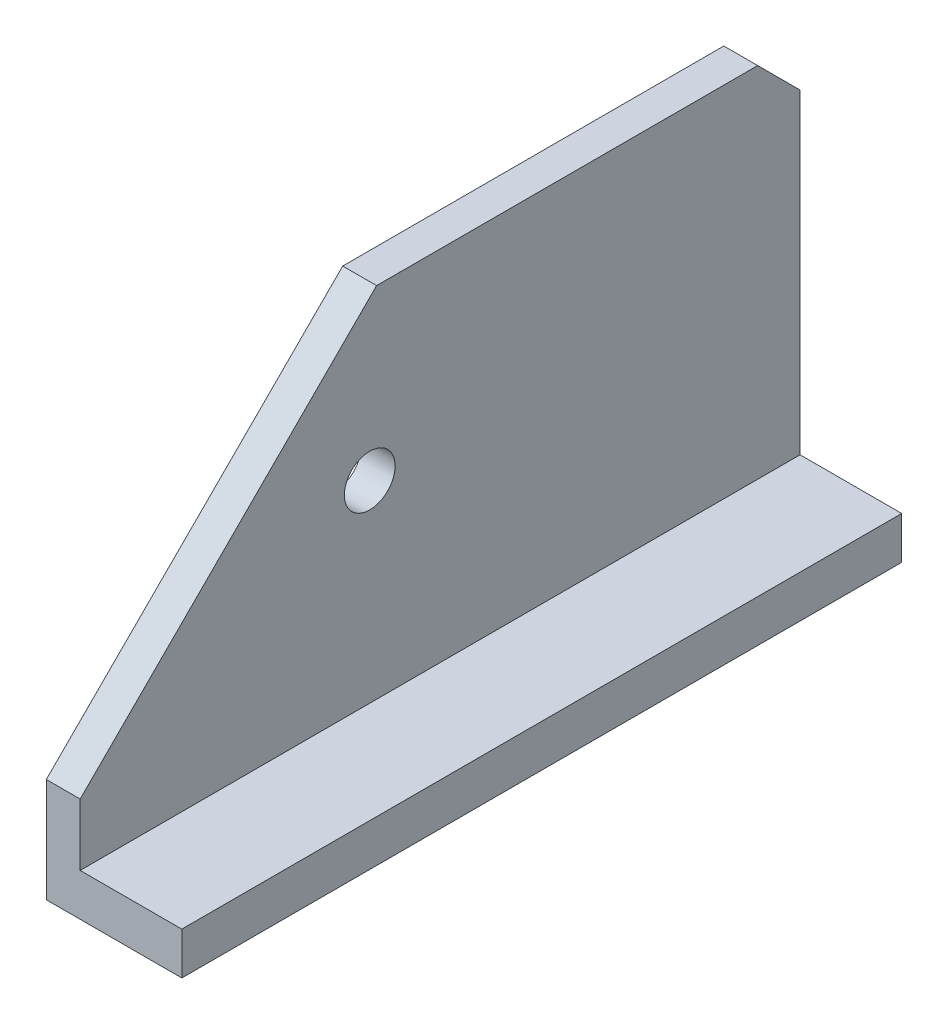
ISO-10303-21;
HEADER;
FILE_DESCRIPTION(('STEP AP214'),'2;1');
FILE_NAME('part.step','',(''),(''),'','','');
FILE_SCHEMA(('AUTOMOTIVE_DESIGN { 1 0 10303 214 1 1 1 1 }'));
ENDSEC;
DATA;
#1=APPLICATION_CONTEXT('core data for automotive mechanical design processes');
#2=APPLICATION_PROTOCOL_DEFINITION('international standard','automotive_design',2000,#1);
#3=PRODUCT_CONTEXT('',#1,'mechanical');
#4=PRODUCT('Part','Part','',(#3));
#5=PRODUCT_RELATED_PRODUCT_CATEGORY('part','',(#4));
#6=PRODUCT_DEFINITION_FORMATION('','',#4);
#7=PRODUCT_DEFINITION_CONTEXT('part definition',#1,'design');
#8=PRODUCT_DEFINITION('design','',#6,#7);
#9=PRODUCT_DEFINITION_SHAPE('','',#8);
#10=(LENGTH_UNIT() NAMED_UNIT(*) SI_UNIT(.MILLI.,.METRE.));
#11=(NAMED_UNIT(*) PLANE_ANGLE_UNIT() SI_UNIT($,.RADIAN.));
#12=(NAMED_UNIT(*) SI_UNIT($,.STERADIAN.) SOLID_ANGLE_UNIT());
#13=UNCERTAINTY_MEASURE_WITH_UNIT(LENGTH_MEASURE(1.E-05),#10,'distance_accuracy_value','');
#14=(GEOMETRIC_REPRESENTATION_CONTEXT(3) GLOBAL_UNCERTAINTY_ASSIGNED_CONTEXT((#13)) GLOBAL_UNIT_ASSIGNED_CONTEXT((#10,
#11,#12)) REPRESENTATION_CONTEXT('',''));
#15=CARTESIAN_POINT('',(0.,0.,0.));
#16=DIRECTION('',(0.,0.,1.));
#17=DIRECTION('',(1.,0.,0.));
#18=AXIS2_PLACEMENT_3D('',#15,#16,#17);
#19=CARTESIAN_POINT('',(0.,0.,85.));
#20=DIRECTION('',(-1.,0.,0.));
#21=DIRECTION('',(0.,0.,1.));
#22=AXIS2_PLACEMENT_3D('',#19,#20,#21);
#23=PLANE('',#22);
#24=CARTESIAN_POINT('',(0.,22.773427236541,50.8134692351987));
#25=DIRECTION('',(-1.,0.,0.));
#26=DIRECTION('',(0.,0.,1.));
#27=AXIS2_PLACEMENT_3D('',#24,#25,#26);
#28=CIRCLE('',#27,2.99999999999999);
#29=CARTESIAN_POINT('',(0.,22.773427236541,53.8134692351987));
#30=VERTEX_POINT('',#29);
#31=EDGE_CURVE('E129',#30,#30,#28,.T.);
#32=ORIENTED_EDGE('',*,*,#31,.T.);
#33=EDGE_LOOP('',(#32));
#34=FACE_BOUND('',#33,.T.);
#35=DIRECTION('',(0.,1.,0.));
#36=VECTOR('',#35,1.);
#37=CARTESIAN_POINT('',(0.,0.,0.));
#38=LINE('',#37,#36);
#39=CARTESIAN_POINT('',(0.,0.,0.));
#40=VERTEX_POINT('',#39);
#41=CARTESIAN_POINT('',(0.,37.3000000000002,0.));
#42=VERTEX_POINT('',#41);
#43=EDGE_CURVE('E127',#40,#42,#38,.T.);
#44=ORIENTED_EDGE('',*,*,#43,.T.);
#45=DIRECTION('',(0.,-0.707106781186548,-0.707106781186548));
#46=VECTOR('',#45,1.);
#47=CARTESIAN_POINT('',(0.,42.3000000000002,5.));
#48=LINE('',#47,#46);
#49=CARTESIAN_POINT('',(0.,42.3000000000002,5.00000000000002));
#50=VERTEX_POINT('',#49);
#51=EDGE_CURVE('E11',#42,#50,#48,.F.);
#52=ORIENTED_EDGE('',*,*,#51,.T.);
#53=DIRECTION('',(0.,0.,-1.));
#54=VECTOR('',#53,1.);
#55=CARTESIAN_POINT('',(0.,42.3000000000002,85.));
#56=LINE('',#55,#54);
#57=CARTESIAN_POINT('',(0.,42.3000000000002,49.9999999999999));
#58=VERTEX_POINT('',#57);
#59=EDGE_CURVE('E144',#58,#50,#56,.T.);
#60=ORIENTED_EDGE('',*,*,#59,.F.);
#61=DIRECTION('',(0.,-0.707106781186546,0.707106781186549));
#62=VECTOR('',#61,1.);
#63=CARTESIAN_POINT('',(0.,7.30000000000024,85.));
#64=LINE('',#63,#62);
#65=CARTESIAN_POINT('',(0.,7.30000000000024,85.));
#66=VERTEX_POINT('',#65);
#67=EDGE_CURVE('E152',#58,#66,#64,.T.);
#68=ORIENTED_EDGE('',*,*,#67,.T.);
#69=DIRECTION('',(0.,1.,0.));
#70=VECTOR('',#69,1.);
#71=CARTESIAN_POINT('',(0.,0.,85.));
#72=LINE('',#71,#70);
#73=CARTESIAN_POINT('',(0.,0.,85.));
#74=VERTEX_POINT('',#73);
#75=EDGE_CURVE('E105',#74,#66,#72,.T.);
#76=ORIENTED_EDGE('',*,*,#75,.F.);
#77=DIRECTION('',(0.,0.,-1.));
#78=VECTOR('',#77,1.);
#79=CARTESIAN_POINT('',(0.,0.,85.));
#80=LINE('',#79,#78);
#81=EDGE_CURVE('E126',#74,#40,#80,.T.);
#82=ORIENTED_EDGE('',*,*,#81,.T.);
#83=EDGE_LOOP('',(#44,#52,#60,#68,#76,#82));
#84=FACE_BOUND('',#83,.T.);
#85=ADVANCED_FACE('F32',(#34,#84),#23,.F.);
#86=CARTESIAN_POINT('',(0.,42.3000000000002,85.));
#87=DIRECTION('',(0.,-1.,0.));
#88=DIRECTION('',(0.,0.,-1.));
#89=AXIS2_PLACEMENT_3D('',#86,#87,#88);
#90=PLANE('',#89);
#91=ORIENTED_EDGE('',*,*,#59,.T.);
#92=DIRECTION('',(-1.,0.,0.));
#93=VECTOR('',#92,1.);
#94=CARTESIAN_POINT('',(0.,42.3000000000002,5.));
#95=LINE('',#94,#93);
#96=CARTESIAN_POINT('',(-4.,42.3000000000002,5.00000000000002));
#97=VERTEX_POINT('',#96);
#98=EDGE_CURVE('E154',#50,#97,#95,.T.);
#99=ORIENTED_EDGE('',*,*,#98,.T.);
#100=DIRECTION('',(0.,0.,-1.));
#101=VECTOR('',#100,1.);
#102=CARTESIAN_POINT('',(-4.,42.3000000000002,85.));
#103=LINE('',#102,#101);
#104=CARTESIAN_POINT('',(-4.,42.3000000000002,49.9999999999999));
#105=VERTEX_POINT('',#104);
#106=EDGE_CURVE('E113',#105,#97,#103,.T.);
#107=ORIENTED_EDGE('',*,*,#106,.F.);
#108=DIRECTION('',(1.,0.,0.));
#109=VECTOR('',#108,1.);
#110=CARTESIAN_POINT('',(0.,42.3000000000002,49.9999999999999));
#111=LINE('',#110,#109);
#112=EDGE_CURVE('E150',#105,#58,#111,.T.);
#113=ORIENTED_EDGE('',*,*,#112,.T.);
#114=EDGE_LOOP('',(#91,#99,#107,#113));
#115=FACE_BOUND('',#114,.T.);
#116=ADVANCED_FACE('F160',(#115),#90,.F.);
#117=CARTESIAN_POINT('',(-4.,-5.,85.));
#118=DIRECTION('',(1.,0.,0.));
#119=DIRECTION('',(0.,0.,-1.));
#120=AXIS2_PLACEMENT_3D('',#117,#118,#119);
#121=PLANE('',#120);
#122=CARTESIAN_POINT('',(-4.,22.773427236541,50.8134692351987));
#123=DIRECTION('',(-1.,0.,0.));
#124=DIRECTION('',(0.,0.,1.));
#125=AXIS2_PLACEMENT_3D('',#122,#123,#124);
#126=CIRCLE('',#125,2.99999999999999);
#127=CARTESIAN_POINT('',(-4.,22.773427236541,53.8134692351987));
#128=VERTEX_POINT('',#127);
#129=EDGE_CURVE('E209',#128,#128,#126,.T.);
#130=ORIENTED_EDGE('',*,*,#129,.F.);
#131=EDGE_LOOP('',(#130));
#132=FACE_BOUND('',#131,.T.);
#133=ORIENTED_EDGE('',*,*,#106,.T.);
#134=DIRECTION('',(0.,0.707106781186548,0.707106781186548));
#135=VECTOR('',#134,1.);
#136=CARTESIAN_POINT('',(-4.,42.3000000000002,5.));
#137=LINE('',#136,#135);
#138=CARTESIAN_POINT('',(-4.,37.3000000000002,0.));
#139=VERTEX_POINT('',#138);
#140=EDGE_CURVE('E54',#97,#139,#137,.F.);
#141=ORIENTED_EDGE('',*,*,#140,.T.);
#142=DIRECTION('',(0.,-1.,0.));
#143=VECTOR('',#142,1.);
#144=CARTESIAN_POINT('',(-4.,-5.,0.));
#145=LINE('',#144,#143);
#146=CARTESIAN_POINT('',(-4.,-5.,0.));
#147=VERTEX_POINT('',#146);
#148=EDGE_CURVE('E110',#139,#147,#145,.T.);
#149=ORIENTED_EDGE('',*,*,#148,.T.);
#150=DIRECTION('',(0.,0.,-1.));
#151=VECTOR('',#150,1.);
#152=CARTESIAN_POINT('',(-4.,-5.,85.));
#153=LINE('',#152,#151);
#154=CARTESIAN_POINT('',(-4.,-5.,85.));
#155=VERTEX_POINT('',#154);
#156=EDGE_CURVE('E108',#155,#147,#153,.T.);
#157=ORIENTED_EDGE('',*,*,#156,.F.);
#158=DIRECTION('',(0.,-1.,0.));
#159=VECTOR('',#158,1.);
#160=CARTESIAN_POINT('',(-4.,-5.,85.));
#161=LINE('',#160,#159);
#162=CARTESIAN_POINT('',(-4.,7.30000000000024,85.));
#163=VERTEX_POINT('',#162);
#164=EDGE_CURVE('E96',#163,#155,#161,.T.);
#165=ORIENTED_EDGE('',*,*,#164,.F.);
#166=DIRECTION('',(0.,0.707106781186546,-0.707106781186549));
#167=VECTOR('',#166,1.);
#168=CARTESIAN_POINT('',(-4.,7.30000000000024,85.));
#169=LINE('',#168,#167);
#170=EDGE_CURVE('E148',#163,#105,#169,.T.);
#171=ORIENTED_EDGE('',*,*,#170,.T.);
#172=EDGE_LOOP('',(#133,#141,#149,#157,#165,#171));
#173=FACE_BOUND('',#172,.T.);
#174=ADVANCED_FACE('F109',(#132,#173),#121,.F.);
#175=CARTESIAN_POINT('',(-4.,-5.,85.));
#176=DIRECTION('',(0.,1.,0.));
#177=DIRECTION('',(0.,0.,1.));
#178=AXIS2_PLACEMENT_3D('',#175,#176,#177);
#179=PLANE('',#178);
#180=DIRECTION('',(1.,0.,0.));
#181=VECTOR('',#180,1.);
#182=CARTESIAN_POINT('',(-4.,-5.,0.));
#183=LINE('',#182,#181);
#184=CARTESIAN_POINT('',(12.,-5.,0.));
#185=VERTEX_POINT('',#184);
#186=EDGE_CURVE('E131',#147,#185,#183,.T.);
#187=ORIENTED_EDGE('',*,*,#186,.T.);
#188=DIRECTION('',(0.,0.,-1.));
#189=VECTOR('',#188,1.);
#190=CARTESIAN_POINT('',(12.,-5.,85.));
#191=LINE('',#190,#189);
#192=CARTESIAN_POINT('',(12.,-5.,85.));
#193=VERTEX_POINT('',#192);
#194=EDGE_CURVE('E114',#193,#185,#191,.T.);
#195=ORIENTED_EDGE('',*,*,#194,.F.);
#196=DIRECTION('',(1.,0.,0.));
#197=VECTOR('',#196,1.);
#198=CARTESIAN_POINT('',(-4.,-5.,85.));
#199=LINE('',#198,#197);
#200=EDGE_CURVE('E101',#155,#193,#199,.T.);
#201=ORIENTED_EDGE('',*,*,#200,.F.);
#202=ORIENTED_EDGE('',*,*,#156,.T.);
#203=EDGE_LOOP('',(#187,#195,#201,#202));
#204=FACE_BOUND('',#203,.T.);
#205=ADVANCED_FACE('F116',(#204),#179,.F.);
#206=CARTESIAN_POINT('',(12.,0.,85.));
#207=DIRECTION('',(-1.,0.,0.));
#208=DIRECTION('',(0.,0.,1.));
#209=AXIS2_PLACEMENT_3D('',#206,#207,#208);
#210=PLANE('',#209);
#211=DIRECTION('',(0.,1.,0.));
#212=VECTOR('',#211,1.);
#213=CARTESIAN_POINT('',(12.,0.,0.));
#214=LINE('',#213,#212);
#215=CARTESIAN_POINT('',(12.,0.,0.));
#216=VERTEX_POINT('',#215);
#217=EDGE_CURVE('E133',#185,#216,#214,.T.);
#218=ORIENTED_EDGE('',*,*,#217,.T.);
#219=DIRECTION('',(0.,0.,-1.));
#220=VECTOR('',#219,1.);
#221=CARTESIAN_POINT('',(12.,0.,85.));
#222=LINE('',#221,#220);
#223=CARTESIAN_POINT('',(12.,0.,85.));
#224=VERTEX_POINT('',#223);
#225=EDGE_CURVE('E139',#224,#216,#222,.T.);
#226=ORIENTED_EDGE('',*,*,#225,.F.);
#227=DIRECTION('',(0.,1.,0.));
#228=VECTOR('',#227,1.);
#229=CARTESIAN_POINT('',(12.,0.,85.));
#230=LINE('',#229,#228);
#231=EDGE_CURVE('E119',#193,#224,#230,.T.);
#232=ORIENTED_EDGE('',*,*,#231,.F.);
#233=ORIENTED_EDGE('',*,*,#194,.T.);
#234=EDGE_LOOP('',(#218,#226,#232,#233));
#235=FACE_BOUND('',#234,.T.);
#236=ADVANCED_FACE('F189',(#235),#210,.F.);
#237=CARTESIAN_POINT('',(0.,0.,85.));
#238=DIRECTION('',(0.,-1.,0.));
#239=DIRECTION('',(0.,0.,-1.));
#240=AXIS2_PLACEMENT_3D('',#237,#238,#239);
#241=PLANE('',#240);
#242=DIRECTION('',(-1.,0.,0.));
#243=VECTOR('',#242,1.);
#244=CARTESIAN_POINT('',(0.,0.,0.));
#245=LINE('',#244,#243);
#246=EDGE_CURVE('E135',#216,#40,#245,.T.);
#247=ORIENTED_EDGE('',*,*,#246,.T.);
#248=ORIENTED_EDGE('',*,*,#81,.F.);
#249=DIRECTION('',(-1.,0.,0.));
#250=VECTOR('',#249,1.);
#251=CARTESIAN_POINT('',(0.,0.,85.));
#252=LINE('',#251,#250);
#253=EDGE_CURVE('E121',#224,#74,#252,.T.);
#254=ORIENTED_EDGE('',*,*,#253,.F.);
#255=ORIENTED_EDGE('',*,*,#225,.T.);
#256=EDGE_LOOP('',(#247,#248,#254,#255));
#257=FACE_BOUND('',#256,.T.);
#258=ADVANCED_FACE('F192',(#257),#241,.F.);
#259=CARTESIAN_POINT('',(0.,42.3000000000002,85.));
#260=DIRECTION('',(0.,0.,1.));
#261=DIRECTION('',(1.,0.,0.));
#262=AXIS2_PLACEMENT_3D('',#259,#260,#261);
#263=PLANE('',#262);
#264=ORIENTED_EDGE('',*,*,#75,.T.);
#265=DIRECTION('',(-1.,0.,0.));
#266=VECTOR('',#265,1.);
#267=CARTESIAN_POINT('',(-4.,7.30000000000024,85.));
#268=LINE('',#267,#266);
#269=EDGE_CURVE('E104',#66,#163,#268,.T.);
#270=ORIENTED_EDGE('',*,*,#269,.T.);
#271=ORIENTED_EDGE('',*,*,#164,.T.);
#272=ORIENTED_EDGE('',*,*,#200,.T.);
#273=ORIENTED_EDGE('',*,*,#231,.T.);
#274=ORIENTED_EDGE('',*,*,#253,.T.);
#275=EDGE_LOOP('',(#264,#270,#271,#272,#273,#274));
#276=FACE_BOUND('',#275,.T.);
#277=ADVANCED_FACE('F99',(#276),#263,.T.);
#278=CARTESIAN_POINT('',(0.,42.3000000000002,0.));
#279=DIRECTION('',(0.,0.,1.));
#280=DIRECTION('',(1.,0.,0.));
#281=AXIS2_PLACEMENT_3D('',#278,#279,#280);
#282=PLANE('',#281);
#283=ORIENTED_EDGE('',*,*,#148,.F.);
#284=DIRECTION('',(1.,0.,0.));
#285=VECTOR('',#284,1.);
#286=CARTESIAN_POINT('',(0.,37.3000000000002,0.));
#287=LINE('',#286,#285);
#288=EDGE_CURVE('E40',#139,#42,#287,.T.);
#289=ORIENTED_EDGE('',*,*,#288,.T.);
#290=ORIENTED_EDGE('',*,*,#43,.F.);
#291=ORIENTED_EDGE('',*,*,#246,.F.);
#292=ORIENTED_EDGE('',*,*,#217,.F.);
#293=ORIENTED_EDGE('',*,*,#186,.F.);
#294=EDGE_LOOP('',(#283,#289,#290,#291,#292,#293));
#295=FACE_BOUND('',#294,.T.);
#296=ADVANCED_FACE('F197',(#295),#282,.F.);
#297=CARTESIAN_POINT('',(12.,22.773427236541,50.8134692351987));
#298=DIRECTION('',(-1.,0.,0.));
#299=DIRECTION('',(0.,0.,1.));
#300=AXIS2_PLACEMENT_3D('',#297,#298,#299);
#301=CYLINDRICAL_SURFACE('',#300,2.99999999999999);
#302=ORIENTED_EDGE('',*,*,#129,.T.);
#303=EDGE_LOOP('',(#302));
#304=FACE_BOUND('',#303,.T.);
#305=ORIENTED_EDGE('',*,*,#31,.F.);
#306=EDGE_LOOP('',(#305));
#307=FACE_BOUND('',#306,.T.);
#308=ADVANCED_FACE('F174',(#304,#307),#301,.F.);
#309=CARTESIAN_POINT('',(0.,7.30000000000024,85.));
#310=DIRECTION('',(0.,0.707106781186549,0.707106781186546));
#311=DIRECTION('',(0.,-0.707106781186546,0.707106781186549));
#312=AXIS2_PLACEMENT_3D('',#309,#310,#311);
#313=PLANE('',#312);
#314=ORIENTED_EDGE('',*,*,#67,.F.);
#315=ORIENTED_EDGE('',*,*,#112,.F.);
#316=ORIENTED_EDGE('',*,*,#170,.F.);
#317=ORIENTED_EDGE('',*,*,#269,.F.);
#318=EDGE_LOOP('',(#314,#315,#316,#317));
#319=FACE_BOUND('',#318,.T.);
#320=ADVANCED_FACE('F167',(#319),#313,.T.);
#321=CARTESIAN_POINT('',(0.,42.3000000000002,5.));
#322=DIRECTION('',(0.,-0.707106781186547,0.707106781186547));
#323=DIRECTION('',(0.,-0.707106781186548,-0.707106781186548));
#324=AXIS2_PLACEMENT_3D('',#321,#322,#323);
#325=PLANE('',#324);
#326=ORIENTED_EDGE('',*,*,#51,.F.);
#327=ORIENTED_EDGE('',*,*,#288,.F.);
#328=ORIENTED_EDGE('',*,*,#140,.F.);
#329=ORIENTED_EDGE('',*,*,#98,.F.);
#330=EDGE_LOOP('',(#326,#327,#328,#329));
#331=FACE_BOUND('',#330,.T.);
#332=ADVANCED_FACE('F34',(#331),#325,.F.);
#333=CLOSED_SHELL('',(#85,#116,#174,#205,#236,#258,#277,#296,#308,#320,#332));
#334=MANIFOLD_SOLID_BREP('B2',#333);
#335=ADVANCED_BREP_SHAPE_REPRESENTATION('',(#18,#334),#14);
#336=SHAPE_DEFINITION_REPRESENTATION(#9,#335);
ENDSEC;
END-ISO-10303-21;
